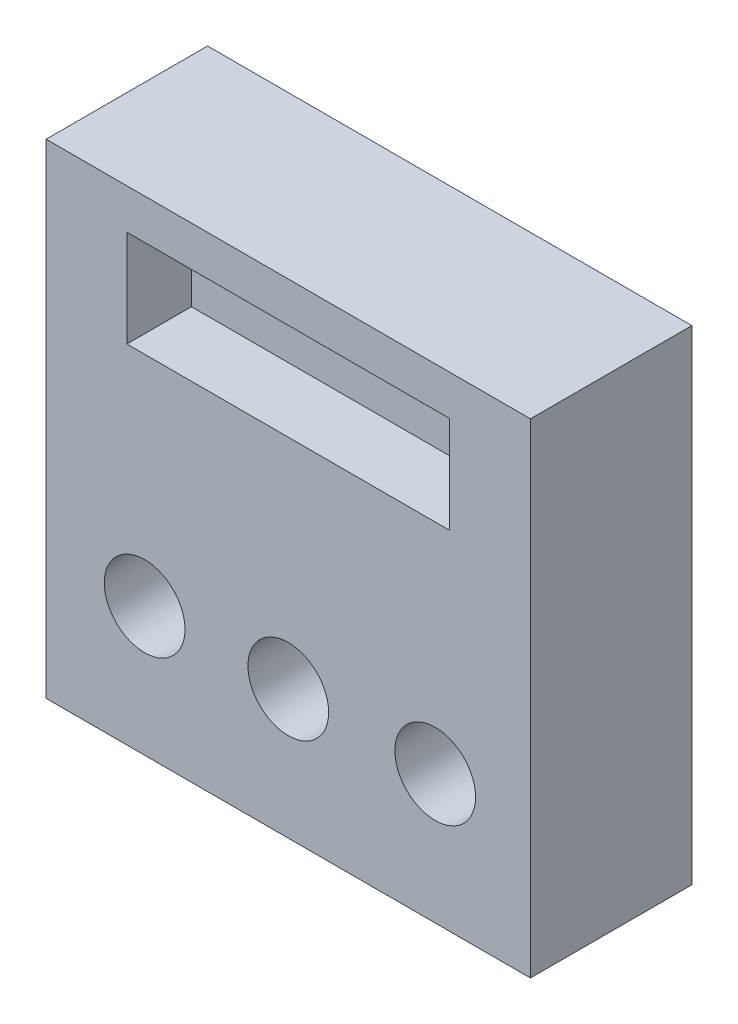
ISO-10303-21;
HEADER;
FILE_DESCRIPTION(('STEP AP214'),'2;1');
FILE_NAME('part.step','',(''),(''),'','','');
FILE_SCHEMA(('AUTOMOTIVE_DESIGN { 1 0 10303 214 1 1 1 1 }'));
ENDSEC;
DATA;
#1=APPLICATION_CONTEXT('core data for automotive mechanical design processes');
#2=APPLICATION_PROTOCOL_DEFINITION('international standard','automotive_design',2000,#1);
#3=PRODUCT_CONTEXT('',#1,'mechanical');
#4=PRODUCT('Part','Part','',(#3));
#5=PRODUCT_RELATED_PRODUCT_CATEGORY('part','',(#4));
#6=PRODUCT_DEFINITION_FORMATION('','',#4);
#7=PRODUCT_DEFINITION_CONTEXT('part definition',#1,'design');
#8=PRODUCT_DEFINITION('design','',#6,#7);
#9=PRODUCT_DEFINITION_SHAPE('','',#8);
#10=(LENGTH_UNIT() NAMED_UNIT(*) SI_UNIT(.MILLI.,.METRE.));
#11=(NAMED_UNIT(*) PLANE_ANGLE_UNIT() SI_UNIT($,.RADIAN.));
#12=(NAMED_UNIT(*) SI_UNIT($,.STERADIAN.) SOLID_ANGLE_UNIT());
#13=UNCERTAINTY_MEASURE_WITH_UNIT(LENGTH_MEASURE(1.E-05),#10,'distance_accuracy_value','');
#14=(GEOMETRIC_REPRESENTATION_CONTEXT(3) GLOBAL_UNCERTAINTY_ASSIGNED_CONTEXT((#13)) GLOBAL_UNIT_ASSIGNED_CONTEXT((#10,
#11,#12)) REPRESENTATION_CONTEXT('',''));
#15=CARTESIAN_POINT('',(0.,0.,0.));
#16=DIRECTION('',(0.,0.,1.));
#17=DIRECTION('',(1.,0.,0.));
#18=AXIS2_PLACEMENT_3D('',#15,#16,#17);
#19=CARTESIAN_POINT('',(75.,75.,50.));
#20=DIRECTION('',(-1.,0.,0.));
#21=DIRECTION('',(0.,-1.,0.));
#22=AXIS2_PLACEMENT_3D('',#19,#20,#21);
#23=PLANE('',#22);
#24=DIRECTION('',(0.,1.,0.));
#25=VECTOR('',#24,1.);
#26=CARTESIAN_POINT('',(75.,75.,0.));
#27=LINE('',#26,#25);
#28=CARTESIAN_POINT('',(75.,-75.,0.));
#29=VERTEX_POINT('',#28);
#30=CARTESIAN_POINT('',(75.,75.,0.));
#31=VERTEX_POINT('',#30);
#32=EDGE_CURVE('E160',#29,#31,#27,.T.);
#33=ORIENTED_EDGE('',*,*,#32,.T.);
#34=DIRECTION('',(0.,0.,-1.));
#35=VECTOR('',#34,1.);
#36=CARTESIAN_POINT('',(75.,75.,50.));
#37=LINE('',#36,#35);
#38=CARTESIAN_POINT('',(75.,75.,50.));
#39=VERTEX_POINT('',#38);
#40=EDGE_CURVE('E13',#39,#31,#37,.T.);
#41=ORIENTED_EDGE('',*,*,#40,.F.);
#42=DIRECTION('',(0.,1.,0.));
#43=VECTOR('',#42,1.);
#44=CARTESIAN_POINT('',(75.,75.,50.));
#45=LINE('',#44,#43);
#46=CARTESIAN_POINT('',(75.,-75.,50.));
#47=VERTEX_POINT('',#46);
#48=EDGE_CURVE('E164',#47,#39,#45,.T.);
#49=ORIENTED_EDGE('',*,*,#48,.F.);
#50=DIRECTION('',(0.,0.,-1.));
#51=VECTOR('',#50,1.);
#52=CARTESIAN_POINT('',(75.,-75.,50.));
#53=LINE('',#52,#51);
#54=EDGE_CURVE('E170',#47,#29,#53,.T.);
#55=ORIENTED_EDGE('',*,*,#54,.T.);
#56=EDGE_LOOP('',(#33,#41,#49,#55));
#57=FACE_BOUND('',#56,.T.);
#58=ADVANCED_FACE('F48',(#57),#23,.F.);
#59=CARTESIAN_POINT('',(-75.,75.,50.));
#60=DIRECTION('',(0.,-1.,0.));
#61=DIRECTION('',(0.,0.,-1.));
#62=AXIS2_PLACEMENT_3D('',#59,#60,#61);
#63=PLANE('',#62);
#64=DIRECTION('',(-1.,0.,0.));
#65=VECTOR('',#64,1.);
#66=CARTESIAN_POINT('',(-75.,75.,0.));
#67=LINE('',#66,#65);
#68=CARTESIAN_POINT('',(-75.,75.,0.));
#69=VERTEX_POINT('',#68);
#70=EDGE_CURVE('E173',#31,#69,#67,.T.);
#71=ORIENTED_EDGE('',*,*,#70,.T.);
#72=DIRECTION('',(0.,0.,-1.));
#73=VECTOR('',#72,1.);
#74=CARTESIAN_POINT('',(-75.,75.,50.));
#75=LINE('',#74,#73);
#76=CARTESIAN_POINT('',(-75.,75.,50.));
#77=VERTEX_POINT('',#76);
#78=EDGE_CURVE('E55',#77,#69,#75,.T.);
#79=ORIENTED_EDGE('',*,*,#78,.F.);
#80=DIRECTION('',(-1.,0.,0.));
#81=VECTOR('',#80,1.);
#82=CARTESIAN_POINT('',(-75.,75.,50.));
#83=LINE('',#82,#81);
#84=EDGE_CURVE('E99',#39,#77,#83,.T.);
#85=ORIENTED_EDGE('',*,*,#84,.F.);
#86=ORIENTED_EDGE('',*,*,#40,.T.);
#87=EDGE_LOOP('',(#71,#79,#85,#86));
#88=FACE_BOUND('',#87,.T.);
#89=ADVANCED_FACE('F202',(#88),#63,.F.);
#90=CARTESIAN_POINT('',(-75.,75.,50.));
#91=DIRECTION('',(1.,0.,0.));
#92=DIRECTION('',(0.,1.,0.));
#93=AXIS2_PLACEMENT_3D('',#90,#91,#92);
#94=PLANE('',#93);
#95=DIRECTION('',(0.,-1.,0.));
#96=VECTOR('',#95,1.);
#97=CARTESIAN_POINT('',(-75.,75.,0.));
#98=LINE('',#97,#96);
#99=CARTESIAN_POINT('',(-75.,-75.,0.));
#100=VERTEX_POINT('',#99);
#101=EDGE_CURVE('E175',#69,#100,#98,.T.);
#102=ORIENTED_EDGE('',*,*,#101,.T.);
#103=DIRECTION('',(0.,0.,-1.));
#104=VECTOR('',#103,1.);
#105=CARTESIAN_POINT('',(-75.,-75.,50.));
#106=LINE('',#105,#104);
#107=CARTESIAN_POINT('',(-75.,-75.,50.));
#108=VERTEX_POINT('',#107);
#109=EDGE_CURVE('E179',#108,#100,#106,.T.);
#110=ORIENTED_EDGE('',*,*,#109,.F.);
#111=DIRECTION('',(0.,-1.,0.));
#112=VECTOR('',#111,1.);
#113=CARTESIAN_POINT('',(-75.,75.,50.));
#114=LINE('',#113,#112);
#115=EDGE_CURVE('E167',#77,#108,#114,.T.);
#116=ORIENTED_EDGE('',*,*,#115,.F.);
#117=ORIENTED_EDGE('',*,*,#78,.T.);
#118=EDGE_LOOP('',(#102,#110,#116,#117));
#119=FACE_BOUND('',#118,.T.);
#120=ADVANCED_FACE('F184',(#119),#94,.F.);
#121=CARTESIAN_POINT('',(-75.,-75.,50.));
#122=DIRECTION('',(0.,1.,0.));
#123=DIRECTION('',(0.,0.,1.));
#124=AXIS2_PLACEMENT_3D('',#121,#122,#123);
#125=PLANE('',#124);
#126=DIRECTION('',(1.,0.,0.));
#127=VECTOR('',#126,1.);
#128=CARTESIAN_POINT('',(-75.,-75.,0.));
#129=LINE('',#128,#127);
#130=EDGE_CURVE('E92',#100,#29,#129,.T.);
#131=ORIENTED_EDGE('',*,*,#130,.T.);
#132=ORIENTED_EDGE('',*,*,#54,.F.);
#133=DIRECTION('',(1.,0.,0.));
#134=VECTOR('',#133,1.);
#135=CARTESIAN_POINT('',(-75.,-75.,50.));
#136=LINE('',#135,#134);
#137=EDGE_CURVE('E71',#108,#47,#136,.T.);
#138=ORIENTED_EDGE('',*,*,#137,.F.);
#139=ORIENTED_EDGE('',*,*,#109,.T.);
#140=EDGE_LOOP('',(#131,#132,#138,#139));
#141=FACE_BOUND('',#140,.T.);
#142=ADVANCED_FACE('F192',(#141),#125,.F.);
#143=CARTESIAN_POINT('',(0.,0.,50.));
#144=DIRECTION('',(0.,0.,1.));
#145=DIRECTION('',(1.,0.,0.));
#146=AXIS2_PLACEMENT_3D('',#143,#144,#145);
#147=PLANE('',#146);
#148=CARTESIAN_POINT('',(45.5061179147075,-35.,50.));
#149=DIRECTION('',(0.,0.,1.));
#150=DIRECTION('',(1.,0.,0.));
#151=AXIS2_PLACEMENT_3D('',#148,#149,#150);
#152=CIRCLE('',#151,12.5);
#153=CARTESIAN_POINT('',(58.0061179147075,-35.,50.));
#154=VERTEX_POINT('',#153);
#155=EDGE_CURVE('E345',#154,#154,#152,.T.);
#156=ORIENTED_EDGE('',*,*,#155,.F.);
#157=EDGE_LOOP('',(#156));
#158=FACE_BOUND('',#157,.T.);
#159=CARTESIAN_POINT('',(0.,-35.,50.));
#160=DIRECTION('',(0.,0.,1.));
#161=DIRECTION('',(1.,0.,0.));
#162=AXIS2_PLACEMENT_3D('',#159,#160,#161);
#163=CIRCLE('',#162,12.5);
#164=CARTESIAN_POINT('',(12.5,-35.,50.));
#165=VERTEX_POINT('',#164);
#166=EDGE_CURVE('E344',#165,#165,#163,.T.);
#167=ORIENTED_EDGE('',*,*,#166,.F.);
#168=EDGE_LOOP('',(#167));
#169=FACE_BOUND('',#168,.T.);
#170=CARTESIAN_POINT('',(-44.4938820852925,-35.,50.));
#171=DIRECTION('',(0.,0.,1.));
#172=DIRECTION('',(1.,0.,0.));
#173=AXIS2_PLACEMENT_3D('',#170,#171,#172);
#174=CIRCLE('',#173,12.5);
#175=CARTESIAN_POINT('',(-31.9938820852925,-35.,50.));
#176=VERTEX_POINT('',#175);
#177=EDGE_CURVE('E147',#176,#176,#174,.T.);
#178=ORIENTED_EDGE('',*,*,#177,.F.);
#179=EDGE_LOOP('',(#178));
#180=FACE_BOUND('',#179,.T.);
#181=DIRECTION('',(0.,1.,0.));
#182=VECTOR('',#181,1.);
#183=CARTESIAN_POINT('',(50.,62.5649702107365,50.));
#184=LINE('',#183,#182);
#185=CARTESIAN_POINT('',(50.,32.5649702107365,50.));
#186=VERTEX_POINT('',#185);
#187=CARTESIAN_POINT('',(50.,62.5649702107365,50.));
#188=VERTEX_POINT('',#187);
#189=EDGE_CURVE('E62',#186,#188,#184,.T.);
#190=ORIENTED_EDGE('',*,*,#189,.F.);
#191=DIRECTION('',(1.,0.,0.));
#192=VECTOR('',#191,1.);
#193=CARTESIAN_POINT('',(-50.,32.5649702107365,50.));
#194=LINE('',#193,#192);
#195=CARTESIAN_POINT('',(-50.,32.5649702107365,50.));
#196=VERTEX_POINT('',#195);
#197=EDGE_CURVE('E141',#196,#186,#194,.T.);
#198=ORIENTED_EDGE('',*,*,#197,.F.);
#199=DIRECTION('',(0.,-1.,0.));
#200=VECTOR('',#199,1.);
#201=CARTESIAN_POINT('',(-50.,62.5649702107365,50.));
#202=LINE('',#201,#200);
#203=CARTESIAN_POINT('',(-50.,62.5649702107365,50.));
#204=VERTEX_POINT('',#203);
#205=EDGE_CURVE('E144',#204,#196,#202,.T.);
#206=ORIENTED_EDGE('',*,*,#205,.F.);
#207=DIRECTION('',(-1.,0.,0.));
#208=VECTOR('',#207,1.);
#209=CARTESIAN_POINT('',(-50.,62.5649702107365,50.));
#210=LINE('',#209,#208);
#211=EDGE_CURVE('E153',#188,#204,#210,.T.);
#212=ORIENTED_EDGE('',*,*,#211,.F.);
#213=EDGE_LOOP('',(#190,#198,#206,#212));
#214=FACE_BOUND('',#213,.T.);
#215=ORIENTED_EDGE('',*,*,#48,.T.);
#216=ORIENTED_EDGE('',*,*,#84,.T.);
#217=ORIENTED_EDGE('',*,*,#115,.T.);
#218=ORIENTED_EDGE('',*,*,#137,.T.);
#219=EDGE_LOOP('',(#215,#216,#217,#218));
#220=FACE_BOUND('',#219,.T.);
#221=ADVANCED_FACE('F194',(#158,#169,#180,#214,#220),#147,.T.);
#222=CARTESIAN_POINT('',(0.,0.,0.));
#223=DIRECTION('',(0.,0.,1.));
#224=DIRECTION('',(1.,0.,0.));
#225=AXIS2_PLACEMENT_3D('',#222,#223,#224);
#226=PLANE('',#225);
#227=ORIENTED_EDGE('',*,*,#32,.F.);
#228=ORIENTED_EDGE('',*,*,#130,.F.);
#229=ORIENTED_EDGE('',*,*,#101,.F.);
#230=ORIENTED_EDGE('',*,*,#70,.F.);
#231=EDGE_LOOP('',(#227,#228,#229,#230));
#232=FACE_BOUND('',#231,.T.);
#233=ADVANCED_FACE('F188',(#232),#226,.F.);
#234=CARTESIAN_POINT('',(50.,62.5649702107365,30.));
#235=DIRECTION('',(1.,0.,0.));
#236=DIRECTION('',(0.,1.,0.));
#237=AXIS2_PLACEMENT_3D('',#234,#235,#236);
#238=PLANE('',#237);
#239=ORIENTED_EDGE('',*,*,#189,.T.);
#240=DIRECTION('',(0.,0.,1.));
#241=VECTOR('',#240,1.);
#242=CARTESIAN_POINT('',(50.,62.5649702107365,30.));
#243=LINE('',#242,#241);
#244=CARTESIAN_POINT('',(50.,62.5649702107365,30.));
#245=VERTEX_POINT('',#244);
#246=EDGE_CURVE('E119',#245,#188,#243,.T.);
#247=ORIENTED_EDGE('',*,*,#246,.F.);
#248=DIRECTION('',(0.,1.,0.));
#249=VECTOR('',#248,1.);
#250=CARTESIAN_POINT('',(50.,62.5649702107365,30.));
#251=LINE('',#250,#249);
#252=CARTESIAN_POINT('',(50.,32.5649702107365,30.));
#253=VERTEX_POINT('',#252);
#254=EDGE_CURVE('E123',#253,#245,#251,.T.);
#255=ORIENTED_EDGE('',*,*,#254,.F.);
#256=DIRECTION('',(0.,0.,1.));
#257=VECTOR('',#256,1.);
#258=CARTESIAN_POINT('',(50.,32.5649702107365,30.));
#259=LINE('',#258,#257);
#260=EDGE_CURVE('E158',#253,#186,#259,.T.);
#261=ORIENTED_EDGE('',*,*,#260,.T.);
#262=EDGE_LOOP('',(#239,#247,#255,#261));
#263=FACE_BOUND('',#262,.T.);
#264=ADVANCED_FACE('F121',(#263),#238,.F.);
#265=CARTESIAN_POINT('',(-50.,32.5649702107365,30.));
#266=DIRECTION('',(0.,-1.,0.));
#267=DIRECTION('',(1.,0.,0.));
#268=AXIS2_PLACEMENT_3D('',#265,#266,#267);
#269=PLANE('',#268);
#270=ORIENTED_EDGE('',*,*,#197,.T.);
#271=ORIENTED_EDGE('',*,*,#260,.F.);
#272=DIRECTION('',(1.,0.,0.));
#273=VECTOR('',#272,1.);
#274=CARTESIAN_POINT('',(-50.,32.5649702107365,30.));
#275=LINE('',#274,#273);
#276=CARTESIAN_POINT('',(-50.,32.5649702107365,30.));
#277=VERTEX_POINT('',#276);
#278=EDGE_CURVE('E129',#277,#253,#275,.T.);
#279=ORIENTED_EDGE('',*,*,#278,.F.);
#280=DIRECTION('',(0.,0.,1.));
#281=VECTOR('',#280,1.);
#282=CARTESIAN_POINT('',(-50.,32.5649702107365,30.));
#283=LINE('',#282,#281);
#284=EDGE_CURVE('E161',#277,#196,#283,.T.);
#285=ORIENTED_EDGE('',*,*,#284,.T.);
#286=EDGE_LOOP('',(#270,#271,#279,#285));
#287=FACE_BOUND('',#286,.T.);
#288=ADVANCED_FACE('F236',(#287),#269,.F.);
#289=CARTESIAN_POINT('',(-50.,62.5649702107365,30.));
#290=DIRECTION('',(-1.,0.,0.));
#291=DIRECTION('',(0.,-1.,0.));
#292=AXIS2_PLACEMENT_3D('',#289,#290,#291);
#293=PLANE('',#292);
#294=ORIENTED_EDGE('',*,*,#205,.T.);
#295=ORIENTED_EDGE('',*,*,#284,.F.);
#296=DIRECTION('',(0.,-1.,0.));
#297=VECTOR('',#296,1.);
#298=CARTESIAN_POINT('',(-50.,62.5649702107365,30.));
#299=LINE('',#298,#297);
#300=CARTESIAN_POINT('',(-50.,62.5649702107365,30.));
#301=VERTEX_POINT('',#300);
#302=EDGE_CURVE('E137',#301,#277,#299,.T.);
#303=ORIENTED_EDGE('',*,*,#302,.F.);
#304=DIRECTION('',(0.,0.,1.));
#305=VECTOR('',#304,1.);
#306=CARTESIAN_POINT('',(-50.,62.5649702107365,30.));
#307=LINE('',#306,#305);
#308=EDGE_CURVE('E128',#301,#204,#307,.T.);
#309=ORIENTED_EDGE('',*,*,#308,.T.);
#310=EDGE_LOOP('',(#294,#295,#303,#309));
#311=FACE_BOUND('',#310,.T.);
#312=ADVANCED_FACE('F245',(#311),#293,.F.);
#313=CARTESIAN_POINT('',(-50.,62.5649702107365,30.));
#314=DIRECTION('',(0.,1.,0.));
#315=DIRECTION('',(0.,0.,1.));
#316=AXIS2_PLACEMENT_3D('',#313,#314,#315);
#317=PLANE('',#316);
#318=ORIENTED_EDGE('',*,*,#211,.T.);
#319=ORIENTED_EDGE('',*,*,#308,.F.);
#320=DIRECTION('',(-1.,0.,0.));
#321=VECTOR('',#320,1.);
#322=CARTESIAN_POINT('',(-50.,62.5649702107365,30.));
#323=LINE('',#322,#321);
#324=EDGE_CURVE('E132',#245,#301,#323,.T.);
#325=ORIENTED_EDGE('',*,*,#324,.F.);
#326=ORIENTED_EDGE('',*,*,#246,.T.);
#327=EDGE_LOOP('',(#318,#319,#325,#326));
#328=FACE_BOUND('',#327,.T.);
#329=ADVANCED_FACE('F133',(#328),#317,.F.);
#330=CARTESIAN_POINT('',(0.,0.,30.));
#331=DIRECTION('',(0.,0.,1.));
#332=DIRECTION('',(1.,0.,0.));
#333=AXIS2_PLACEMENT_3D('',#330,#331,#332);
#334=PLANE('',#333);
#335=ORIENTED_EDGE('',*,*,#254,.T.);
#336=ORIENTED_EDGE('',*,*,#324,.T.);
#337=ORIENTED_EDGE('',*,*,#302,.T.);
#338=ORIENTED_EDGE('',*,*,#278,.T.);
#339=EDGE_LOOP('',(#335,#336,#337,#338));
#340=FACE_BOUND('',#339,.T.);
#341=ADVANCED_FACE('F139',(#340),#334,.T.);
#342=CARTESIAN_POINT('',(-44.4938820852925,-35.,5.));
#343=DIRECTION('',(0.,0.,1.));
#344=DIRECTION('',(1.,0.,0.));
#345=AXIS2_PLACEMENT_3D('',#342,#343,#344);
#346=CYLINDRICAL_SURFACE('',#345,12.5);
#347=CARTESIAN_POINT('',(-44.4938820852925,-35.,5.));
#348=DIRECTION('',(0.,0.,1.));
#349=DIRECTION('',(1.,0.,0.));
#350=AXIS2_PLACEMENT_3D('',#347,#348,#349);
#351=CIRCLE('',#350,12.5);
#352=CARTESIAN_POINT('',(-31.9938820852925,-35.,5.));
#353=VERTEX_POINT('',#352);
#354=EDGE_CURVE('E154',#353,#353,#351,.T.);
#355=CARTESIAN_POINT('',(-31.9938820852925,-35.,5.));
#356=CARTESIAN_POINT('',(-31.9938820852925,-35.,5.46875));
#357=CARTESIAN_POINT('',(-31.9938820852925,-35.,5.9375));
#358=CARTESIAN_POINT('',(-31.9938820852925,-35.,6.875));
#359=CARTESIAN_POINT('',(-31.9938820852925,-35.,7.34375));
#360=CARTESIAN_POINT('',(-31.9938820852925,-35.,8.28125));
#361=CARTESIAN_POINT('',(-31.9938820852925,-35.,8.75));
#362=CARTESIAN_POINT('',(-31.9938820852925,-35.,9.6875));
#363=CARTESIAN_POINT('',(-31.9938820852925,-35.,10.15625));
#364=CARTESIAN_POINT('',(-31.9938820852925,-35.,11.09375));
#365=CARTESIAN_POINT('',(-31.9938820852925,-35.,11.5625));
#366=CARTESIAN_POINT('',(-31.9938820852925,-35.,12.5));
#367=CARTESIAN_POINT('',(-31.9938820852925,-35.,12.96875));
#368=CARTESIAN_POINT('',(-31.9938820852925,-35.,13.90625));
#369=CARTESIAN_POINT('',(-31.9938820852925,-35.,14.375));
#370=CARTESIAN_POINT('',(-31.9938820852925,-35.,15.3125));
#371=CARTESIAN_POINT('',(-31.9938820852925,-35.,15.78125));
#372=CARTESIAN_POINT('',(-31.9938820852925,-35.,16.71875));
#373=CARTESIAN_POINT('',(-31.9938820852925,-35.,17.1875));
#374=CARTESIAN_POINT('',(-31.9938820852925,-35.,18.125));
#375=CARTESIAN_POINT('',(-31.9938820852925,-35.,18.59375));
#376=CARTESIAN_POINT('',(-31.9938820852925,-35.,19.53125));
#377=CARTESIAN_POINT('',(-31.9938820852925,-35.,20.));
#378=CARTESIAN_POINT('',(-31.9938820852925,-35.,20.9375));
#379=CARTESIAN_POINT('',(-31.9938820852925,-35.,21.40625));
#380=CARTESIAN_POINT('',(-31.9938820852925,-35.,22.34375));
#381=CARTESIAN_POINT('',(-31.9938820852925,-35.,22.8125));
#382=CARTESIAN_POINT('',(-31.9938820852925,-35.,23.75));
#383=CARTESIAN_POINT('',(-31.9938820852925,-35.,24.21875));
#384=CARTESIAN_POINT('',(-31.9938820852925,-35.,25.15625));
#385=CARTESIAN_POINT('',(-31.9938820852925,-35.,25.625));
#386=CARTESIAN_POINT('',(-31.9938820852925,-35.,26.5625));
#387=CARTESIAN_POINT('',(-31.9938820852925,-35.,27.03125));
#388=CARTESIAN_POINT('',(-31.9938820852925,-35.,27.96875));
#389=CARTESIAN_POINT('',(-31.9938820852925,-35.,28.4375));
#390=CARTESIAN_POINT('',(-31.9938820852925,-35.,29.375));
#391=CARTESIAN_POINT('',(-31.9938820852925,-35.,29.84375));
#392=CARTESIAN_POINT('',(-31.9938820852925,-35.,30.78125));
#393=CARTESIAN_POINT('',(-31.9938820852925,-35.,31.25));
#394=CARTESIAN_POINT('',(-31.9938820852925,-35.,32.1875));
#395=CARTESIAN_POINT('',(-31.9938820852925,-35.,32.65625));
#396=CARTESIAN_POINT('',(-31.9938820852925,-35.,33.59375));
#397=CARTESIAN_POINT('',(-31.9938820852925,-35.,34.0625));
#398=CARTESIAN_POINT('',(-31.9938820852925,-35.,35.));
#399=CARTESIAN_POINT('',(-31.9938820852925,-35.,35.46875));
#400=CARTESIAN_POINT('',(-31.9938820852925,-35.,36.40625));
#401=CARTESIAN_POINT('',(-31.9938820852925,-35.,36.875));
#402=CARTESIAN_POINT('',(-31.9938820852925,-35.,37.8125));
#403=CARTESIAN_POINT('',(-31.9938820852925,-35.,38.28125));
#404=CARTESIAN_POINT('',(-31.9938820852925,-35.,39.21875));
#405=CARTESIAN_POINT('',(-31.9938820852925,-35.,39.6875));
#406=CARTESIAN_POINT('',(-31.9938820852925,-35.,40.625));
#407=CARTESIAN_POINT('',(-31.9938820852925,-35.,41.09375));
#408=CARTESIAN_POINT('',(-31.9938820852925,-35.,42.03125));
#409=CARTESIAN_POINT('',(-31.9938820852925,-35.,42.5));
#410=CARTESIAN_POINT('',(-31.9938820852925,-35.,43.4375));
#411=CARTESIAN_POINT('',(-31.9938820852925,-35.,43.90625));
#412=CARTESIAN_POINT('',(-31.9938820852925,-35.,44.84375));
#413=CARTESIAN_POINT('',(-31.9938820852925,-35.,45.3125));
#414=CARTESIAN_POINT('',(-31.9938820852925,-35.,46.25));
#415=CARTESIAN_POINT('',(-31.9938820852925,-35.,46.71875));
#416=CARTESIAN_POINT('',(-31.9938820852925,-35.,47.65625));
#417=CARTESIAN_POINT('',(-31.9938820852925,-35.,48.125));
#418=CARTESIAN_POINT('',(-31.9938820852925,-35.,49.0625));
#419=CARTESIAN_POINT('',(-31.9938820852925,-35.,49.53125));
#420=CARTESIAN_POINT('',(-31.9938820852925,-35.,50.));
#421=B_SPLINE_CURVE_WITH_KNOTS('',3,(#355,#356,#357,#358,#359,#360,#361,#362,#363,#364,#365,
#366,#367,#368,#369,#370,#371,#372,#373,#374,#375,#376,#377,#378,#379,#380,#381,#382,#383,#384,
#385,#386,#387,#388,#389,#390,#391,#392,#393,#394,#395,#396,#397,#398,#399,#400,#401,#402,#403,
#404,#405,#406,#407,#408,#409,#410,#411,#412,#413,#414,#415,#416,#417,#418,#419,#420),
.UNSPECIFIED.,.F.,.F.,(4,2,2,2,2,2,2,2,2,2,2,2,2,2,2,2,2,2,2,2,2,2,2,2,2,2,2,2,2,2,2,2,4),(0.,
1.40625,2.8125,4.21875,5.625,7.03125,8.4375,9.84375,11.25,12.65625,14.0625,15.46875,16.875,
18.28125,19.6875,21.09375,22.5,23.90625,25.3125,26.71875,28.125,29.53125,30.9375,32.34375,33.75,
35.15625,36.5625,37.96875,39.375,40.78125,42.1875,43.59375,45.),.UNSPECIFIED.);
#422=EDGE_CURVE('BSEAM272',#353,#176,#421,.T.);
#423=ORIENTED_EDGE('',*,*,#354,.F.);
#424=ORIENTED_EDGE('',*,*,#177,.T.);
#425=ORIENTED_EDGE('',*,*,#422,.T.);
#426=ORIENTED_EDGE('',*,*,#422,.F.);
#427=EDGE_LOOP('',(#423,#425,#424,#426));
#428=FACE_BOUND('',#427,.T.);
#429=ADVANCED_FACE('F272',(#428),#346,.F.);
#430=CARTESIAN_POINT('',(-44.4938820852925,-35.,5.));
#431=DIRECTION('',(0.,0.,1.));
#432=DIRECTION('',(1.,0.,0.));
#433=AXIS2_PLACEMENT_3D('',#430,#431,#432);
#434=PLANE('',#433);
#435=ORIENTED_EDGE('',*,*,#354,.T.);
#436=EDGE_LOOP('',(#435));
#437=FACE_BOUND('',#436,.T.);
#438=ADVANCED_FACE('F287',(#437),#434,.T.);
#439=CARTESIAN_POINT('',(0.,-35.,5.));
#440=DIRECTION('',(0.,0.,1.));
#441=DIRECTION('',(1.,0.,0.));
#442=AXIS2_PLACEMENT_3D('',#439,#440,#441);
#443=CYLINDRICAL_SURFACE('',#442,12.5);
#444=CARTESIAN_POINT('',(0.,-35.,5.));
#445=DIRECTION('',(0.,0.,1.));
#446=DIRECTION('',(1.,0.,0.));
#447=AXIS2_PLACEMENT_3D('',#444,#445,#446);
#448=CIRCLE('',#447,12.5);
#449=CARTESIAN_POINT('',(12.5,-35.,5.));
#450=VERTEX_POINT('',#449);
#451=EDGE_CURVE('E348',#450,#450,#448,.T.);
#452=CARTESIAN_POINT('',(12.5,-35.,5.));
#453=CARTESIAN_POINT('',(12.5,-35.,5.46875));
#454=CARTESIAN_POINT('',(12.5,-35.,5.9375));
#455=CARTESIAN_POINT('',(12.5,-35.,6.875));
#456=CARTESIAN_POINT('',(12.5,-35.,7.34375));
#457=CARTESIAN_POINT('',(12.5,-35.,8.28125));
#458=CARTESIAN_POINT('',(12.5,-35.,8.75));
#459=CARTESIAN_POINT('',(12.5,-35.,9.6875));
#460=CARTESIAN_POINT('',(12.5,-35.,10.15625));
#461=CARTESIAN_POINT('',(12.5,-35.,11.09375));
#462=CARTESIAN_POINT('',(12.5,-35.,11.5625));
#463=CARTESIAN_POINT('',(12.5,-35.,12.5));
#464=CARTESIAN_POINT('',(12.5,-35.,12.96875));
#465=CARTESIAN_POINT('',(12.5,-35.,13.90625));
#466=CARTESIAN_POINT('',(12.5,-35.,14.375));
#467=CARTESIAN_POINT('',(12.5,-35.,15.3125));
#468=CARTESIAN_POINT('',(12.5,-35.,15.78125));
#469=CARTESIAN_POINT('',(12.5,-35.,16.71875));
#470=CARTESIAN_POINT('',(12.5,-35.,17.1875));
#471=CARTESIAN_POINT('',(12.5,-35.,18.125));
#472=CARTESIAN_POINT('',(12.5,-35.,18.59375));
#473=CARTESIAN_POINT('',(12.5,-35.,19.53125));
#474=CARTESIAN_POINT('',(12.5,-35.,20.));
#475=CARTESIAN_POINT('',(12.5,-35.,20.9375));
#476=CARTESIAN_POINT('',(12.5,-35.,21.40625));
#477=CARTESIAN_POINT('',(12.5,-35.,22.34375));
#478=CARTESIAN_POINT('',(12.5,-35.,22.8125));
#479=CARTESIAN_POINT('',(12.5,-35.,23.75));
#480=CARTESIAN_POINT('',(12.5,-35.,24.21875));
#481=CARTESIAN_POINT('',(12.5,-35.,25.15625));
#482=CARTESIAN_POINT('',(12.5,-35.,25.625));
#483=CARTESIAN_POINT('',(12.5,-35.,26.5625));
#484=CARTESIAN_POINT('',(12.5,-35.,27.03125));
#485=CARTESIAN_POINT('',(12.5,-35.,27.96875));
#486=CARTESIAN_POINT('',(12.5,-35.,28.4375));
#487=CARTESIAN_POINT('',(12.5,-35.,29.375));
#488=CARTESIAN_POINT('',(12.5,-35.,29.84375));
#489=CARTESIAN_POINT('',(12.5,-35.,30.78125));
#490=CARTESIAN_POINT('',(12.5,-35.,31.25));
#491=CARTESIAN_POINT('',(12.5,-35.,32.1875));
#492=CARTESIAN_POINT('',(12.5,-35.,32.65625));
#493=CARTESIAN_POINT('',(12.5,-35.,33.59375));
#494=CARTESIAN_POINT('',(12.5,-35.,34.0625));
#495=CARTESIAN_POINT('',(12.5,-35.,35.));
#496=CARTESIAN_POINT('',(12.5,-35.,35.46875));
#497=CARTESIAN_POINT('',(12.5,-35.,36.40625));
#498=CARTESIAN_POINT('',(12.5,-35.,36.875));
#499=CARTESIAN_POINT('',(12.5,-35.,37.8125));
#500=CARTESIAN_POINT('',(12.5,-35.,38.28125));
#501=CARTESIAN_POINT('',(12.5,-35.,39.21875));
#502=CARTESIAN_POINT('',(12.5,-35.,39.6875));
#503=CARTESIAN_POINT('',(12.5,-35.,40.625));
#504=CARTESIAN_POINT('',(12.5,-35.,41.09375));
#505=CARTESIAN_POINT('',(12.5,-35.,42.03125));
#506=CARTESIAN_POINT('',(12.5,-35.,42.5));
#507=CARTESIAN_POINT('',(12.5,-35.,43.4375));
#508=CARTESIAN_POINT('',(12.5,-35.,43.90625));
#509=CARTESIAN_POINT('',(12.5,-35.,44.84375));
#510=CARTESIAN_POINT('',(12.5,-35.,45.3125));
#511=CARTESIAN_POINT('',(12.5,-35.,46.25));
#512=CARTESIAN_POINT('',(12.5,-35.,46.71875));
#513=CARTESIAN_POINT('',(12.5,-35.,47.65625));
#514=CARTESIAN_POINT('',(12.5,-35.,48.125));
#515=CARTESIAN_POINT('',(12.5,-35.,49.0625));
#516=CARTESIAN_POINT('',(12.5,-35.,49.53125));
#517=CARTESIAN_POINT('',(12.5,-35.,50.));
#518=B_SPLINE_CURVE_WITH_KNOTS('',3,(#452,#453,#454,#455,#456,#457,#458,#459,#460,#461,#462,
#463,#464,#465,#466,#467,#468,#469,#470,#471,#472,#473,#474,#475,#476,#477,#478,#479,#480,#481,
#482,#483,#484,#485,#486,#487,#488,#489,#490,#491,#492,#493,#494,#495,#496,#497,#498,#499,#500,
#501,#502,#503,#504,#505,#506,#507,#508,#509,#510,#511,#512,#513,#514,#515,#516,#517),
.UNSPECIFIED.,.F.,.F.,(4,2,2,2,2,2,2,2,2,2,2,2,2,2,2,2,2,2,2,2,2,2,2,2,2,2,2,2,2,2,2,2,4),(0.,
1.40625,2.8125,4.21875,5.625,7.03125,8.4375,9.84375,11.25,12.65625,14.0625,15.46875,16.875,
18.28125,19.6875,21.09375,22.5,23.90625,25.3125,26.71875,28.125,29.53125,30.9375,32.34375,33.75,
35.15625,36.5625,37.96875,39.375,40.78125,42.1875,43.59375,45.),.UNSPECIFIED.);
#519=EDGE_CURVE('BSEAM297',#450,#165,#518,.T.);
#520=ORIENTED_EDGE('',*,*,#451,.F.);
#521=ORIENTED_EDGE('',*,*,#166,.T.);
#522=ORIENTED_EDGE('',*,*,#519,.T.);
#523=ORIENTED_EDGE('',*,*,#519,.F.);
#524=EDGE_LOOP('',(#520,#522,#521,#523));
#525=FACE_BOUND('',#524,.T.);
#526=ADVANCED_FACE('F297',(#525),#443,.F.);
#527=CARTESIAN_POINT('',(0.,-35.,5.));
#528=DIRECTION('',(0.,0.,1.));
#529=DIRECTION('',(1.,0.,0.));
#530=AXIS2_PLACEMENT_3D('',#527,#528,#529);
#531=PLANE('',#530);
#532=ORIENTED_EDGE('',*,*,#451,.T.);
#533=EDGE_LOOP('',(#532));
#534=FACE_BOUND('',#533,.T.);
#535=ADVANCED_FACE('F307',(#534),#531,.T.);
#536=CARTESIAN_POINT('',(45.5061179147075,-35.,5.));
#537=DIRECTION('',(0.,0.,1.));
#538=DIRECTION('',(1.,0.,0.));
#539=AXIS2_PLACEMENT_3D('',#536,#537,#538);
#540=CYLINDRICAL_SURFACE('',#539,12.5);
#541=CARTESIAN_POINT('',(45.5061179147075,-35.,5.));
#542=DIRECTION('',(0.,0.,1.));
#543=DIRECTION('',(1.,0.,0.));
#544=AXIS2_PLACEMENT_3D('',#541,#542,#543);
#545=CIRCLE('',#544,12.5);
#546=CARTESIAN_POINT('',(58.0061179147075,-35.,5.));
#547=VERTEX_POINT('',#546);
#548=EDGE_CURVE('E343',#547,#547,#545,.T.);
#549=CARTESIAN_POINT('',(58.0061179147075,-35.,5.));
#550=CARTESIAN_POINT('',(58.0061179147075,-35.,5.46875));
#551=CARTESIAN_POINT('',(58.0061179147075,-35.,5.9375));
#552=CARTESIAN_POINT('',(58.0061179147075,-35.,6.875));
#553=CARTESIAN_POINT('',(58.0061179147075,-35.,7.34375));
#554=CARTESIAN_POINT('',(58.0061179147075,-35.,8.28125));
#555=CARTESIAN_POINT('',(58.0061179147075,-35.,8.75));
#556=CARTESIAN_POINT('',(58.0061179147075,-35.,9.6875));
#557=CARTESIAN_POINT('',(58.0061179147075,-35.,10.15625));
#558=CARTESIAN_POINT('',(58.0061179147075,-35.,11.09375));
#559=CARTESIAN_POINT('',(58.0061179147075,-35.,11.5625));
#560=CARTESIAN_POINT('',(58.0061179147075,-35.,12.5));
#561=CARTESIAN_POINT('',(58.0061179147075,-35.,12.96875));
#562=CARTESIAN_POINT('',(58.0061179147075,-35.,13.90625));
#563=CARTESIAN_POINT('',(58.0061179147075,-35.,14.375));
#564=CARTESIAN_POINT('',(58.0061179147075,-35.,15.3125));
#565=CARTESIAN_POINT('',(58.0061179147075,-35.,15.78125));
#566=CARTESIAN_POINT('',(58.0061179147075,-35.,16.71875));
#567=CARTESIAN_POINT('',(58.0061179147075,-35.,17.1875));
#568=CARTESIAN_POINT('',(58.0061179147075,-35.,18.125));
#569=CARTESIAN_POINT('',(58.0061179147075,-35.,18.59375));
#570=CARTESIAN_POINT('',(58.0061179147075,-35.,19.53125));
#571=CARTESIAN_POINT('',(58.0061179147075,-35.,20.));
#572=CARTESIAN_POINT('',(58.0061179147075,-35.,20.9375));
#573=CARTESIAN_POINT('',(58.0061179147075,-35.,21.40625));
#574=CARTESIAN_POINT('',(58.0061179147075,-35.,22.34375));
#575=CARTESIAN_POINT('',(58.0061179147075,-35.,22.8125));
#576=CARTESIAN_POINT('',(58.0061179147075,-35.,23.75));
#577=CARTESIAN_POINT('',(58.0061179147075,-35.,24.21875));
#578=CARTESIAN_POINT('',(58.0061179147075,-35.,25.15625));
#579=CARTESIAN_POINT('',(58.0061179147075,-35.,25.625));
#580=CARTESIAN_POINT('',(58.0061179147075,-35.,26.5625));
#581=CARTESIAN_POINT('',(58.0061179147075,-35.,27.03125));
#582=CARTESIAN_POINT('',(58.0061179147075,-35.,27.96875));
#583=CARTESIAN_POINT('',(58.0061179147075,-35.,28.4375));
#584=CARTESIAN_POINT('',(58.0061179147075,-35.,29.375));
#585=CARTESIAN_POINT('',(58.0061179147075,-35.,29.84375));
#586=CARTESIAN_POINT('',(58.0061179147075,-35.,30.78125));
#587=CARTESIAN_POINT('',(58.0061179147075,-35.,31.25));
#588=CARTESIAN_POINT('',(58.0061179147075,-35.,32.1875));
#589=CARTESIAN_POINT('',(58.0061179147075,-35.,32.65625));
#590=CARTESIAN_POINT('',(58.0061179147075,-35.,33.59375));
#591=CARTESIAN_POINT('',(58.0061179147075,-35.,34.0625));
#592=CARTESIAN_POINT('',(58.0061179147075,-35.,35.));
#593=CARTESIAN_POINT('',(58.0061179147075,-35.,35.46875));
#594=CARTESIAN_POINT('',(58.0061179147075,-35.,36.40625));
#595=CARTESIAN_POINT('',(58.0061179147075,-35.,36.875));
#596=CARTESIAN_POINT('',(58.0061179147075,-35.,37.8125));
#597=CARTESIAN_POINT('',(58.0061179147075,-35.,38.28125));
#598=CARTESIAN_POINT('',(58.0061179147075,-35.,39.21875));
#599=CARTESIAN_POINT('',(58.0061179147075,-35.,39.6875));
#600=CARTESIAN_POINT('',(58.0061179147075,-35.,40.625));
#601=CARTESIAN_POINT('',(58.0061179147075,-35.,41.09375));
#602=CARTESIAN_POINT('',(58.0061179147075,-35.,42.03125));
#603=CARTESIAN_POINT('',(58.0061179147075,-35.,42.5));
#604=CARTESIAN_POINT('',(58.0061179147075,-35.,43.4375));
#605=CARTESIAN_POINT('',(58.0061179147075,-35.,43.90625));
#606=CARTESIAN_POINT('',(58.0061179147075,-35.,44.84375));
#607=CARTESIAN_POINT('',(58.0061179147075,-35.,45.3125));
#608=CARTESIAN_POINT('',(58.0061179147075,-35.,46.25));
#609=CARTESIAN_POINT('',(58.0061179147075,-35.,46.71875));
#610=CARTESIAN_POINT('',(58.0061179147075,-35.,47.65625));
#611=CARTESIAN_POINT('',(58.0061179147075,-35.,48.125));
#612=CARTESIAN_POINT('',(58.0061179147075,-35.,49.0625));
#613=CARTESIAN_POINT('',(58.0061179147075,-35.,49.53125));
#614=CARTESIAN_POINT('',(58.0061179147075,-35.,50.));
#615=B_SPLINE_CURVE_WITH_KNOTS('',3,(#549,#550,#551,#552,#553,#554,#555,#556,#557,#558,#559,
#560,#561,#562,#563,#564,#565,#566,#567,#568,#569,#570,#571,#572,#573,#574,#575,#576,#577,#578,
#579,#580,#581,#582,#583,#584,#585,#586,#587,#588,#589,#590,#591,#592,#593,#594,#595,#596,#597,
#598,#599,#600,#601,#602,#603,#604,#605,#606,#607,#608,#609,#610,#611,#612,#613,#614),
.UNSPECIFIED.,.F.,.F.,(4,2,2,2,2,2,2,2,2,2,2,2,2,2,2,2,2,2,2,2,2,2,2,2,2,2,2,2,2,2,2,2,4),(0.,
1.40625,2.8125,4.21875,5.625,7.03125,8.4375,9.84375,11.25,12.65625,14.0625,15.46875,16.875,
18.28125,19.6875,21.09375,22.5,23.90625,25.3125,26.71875,28.125,29.53125,30.9375,32.34375,33.75,
35.15625,36.5625,37.96875,39.375,40.78125,42.1875,43.59375,45.),.UNSPECIFIED.);
#616=EDGE_CURVE('BSEAM317',#547,#154,#615,.T.);
#617=ORIENTED_EDGE('',*,*,#548,.F.);
#618=ORIENTED_EDGE('',*,*,#155,.T.);
#619=ORIENTED_EDGE('',*,*,#616,.T.);
#620=ORIENTED_EDGE('',*,*,#616,.F.);
#621=EDGE_LOOP('',(#617,#619,#618,#620));
#622=FACE_BOUND('',#621,.T.);
#623=ADVANCED_FACE('F317',(#622),#540,.F.);
#624=CARTESIAN_POINT('',(45.5061179147075,-35.,5.));
#625=DIRECTION('',(0.,0.,1.));
#626=DIRECTION('',(1.,0.,0.));
#627=AXIS2_PLACEMENT_3D('',#624,#625,#626);
#628=PLANE('',#627);
#629=ORIENTED_EDGE('',*,*,#548,.T.);
#630=EDGE_LOOP('',(#629));
#631=FACE_BOUND('',#630,.T.);
#632=ADVANCED_FACE('F327',(#631),#628,.T.);
#633=CLOSED_SHELL('',(#58,#89,#120,#142,#221,#233,#264,#288,#312,#329,#341,#429,#438,#526,#535,
#623,#632));
#634=MANIFOLD_SOLID_BREP('B2',#633);
#635=ADVANCED_BREP_SHAPE_REPRESENTATION('',(#18,#634),#14);
#636=SHAPE_DEFINITION_REPRESENTATION(#9,#635);
ENDSEC;
END-ISO-10303-21;
